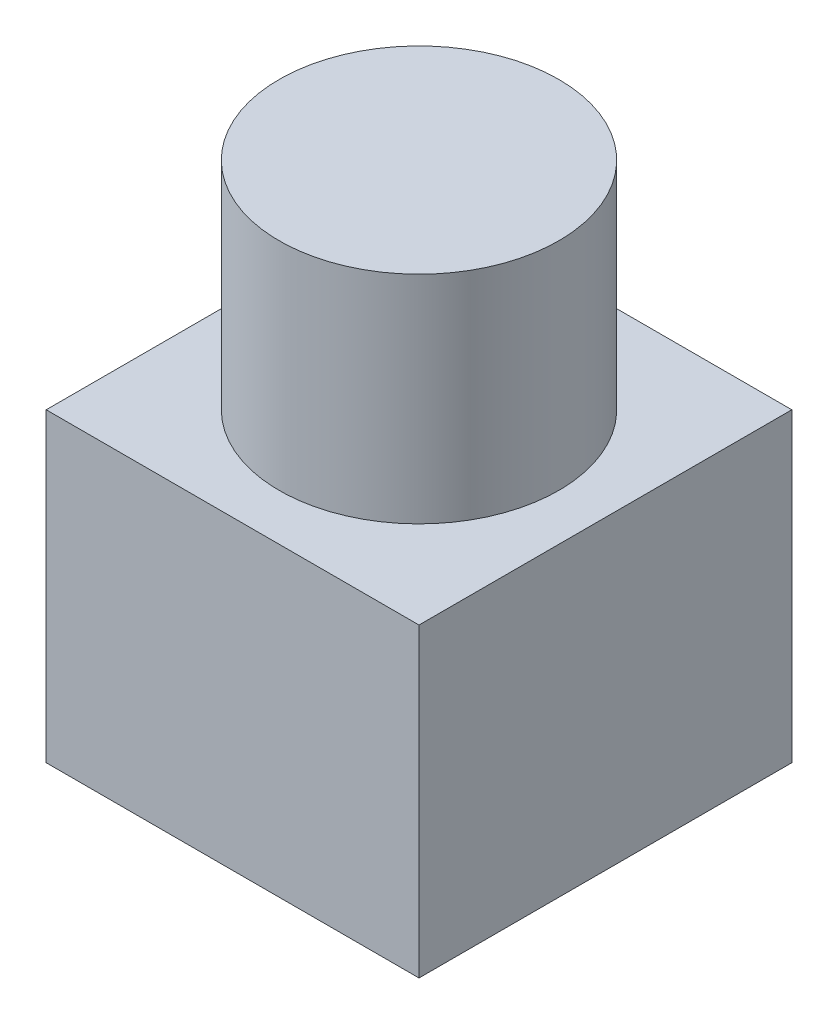
ISO-10303-21;
HEADER;
FILE_DESCRIPTION(('STEP AP214'),'2;1');
FILE_NAME('part.step','',(''),(''),'','','');
FILE_SCHEMA(('AUTOMOTIVE_DESIGN { 1 0 10303 214 1 1 1 1 }'));
ENDSEC;
DATA;
#1=APPLICATION_CONTEXT('core data for automotive mechanical design processes');
#2=APPLICATION_PROTOCOL_DEFINITION('international standard','automotive_design',2000,#1);
#3=PRODUCT_CONTEXT('',#1,'mechanical');
#4=PRODUCT('Part','Part','',(#3));
#5=PRODUCT_RELATED_PRODUCT_CATEGORY('part','',(#4));
#6=PRODUCT_DEFINITION_FORMATION('','',#4);
#7=PRODUCT_DEFINITION_CONTEXT('part definition',#1,'design');
#8=PRODUCT_DEFINITION('design','',#6,#7);
#9=PRODUCT_DEFINITION_SHAPE('','',#8);
#10=(LENGTH_UNIT() NAMED_UNIT(*) SI_UNIT(.MILLI.,.METRE.));
#11=(NAMED_UNIT(*) PLANE_ANGLE_UNIT() SI_UNIT($,.RADIAN.));
#12=(NAMED_UNIT(*) SI_UNIT($,.STERADIAN.) SOLID_ANGLE_UNIT());
#13=UNCERTAINTY_MEASURE_WITH_UNIT(LENGTH_MEASURE(1.E-05),#10,'distance_accuracy_value','');
#14=(GEOMETRIC_REPRESENTATION_CONTEXT(3) GLOBAL_UNCERTAINTY_ASSIGNED_CONTEXT((#13)) GLOBAL_UNIT_ASSIGNED_CONTEXT((#10,
#11,#12)) REPRESENTATION_CONTEXT('',''));
#15=CARTESIAN_POINT('',(0.,0.,0.));
#16=DIRECTION('',(0.,0.,1.));
#17=DIRECTION('',(1.,0.,0.));
#18=AXIS2_PLACEMENT_3D('',#15,#16,#17);
#19=CARTESIAN_POINT('',(25.,41.,25.));
#20=DIRECTION('',(-1.,0.,0.));
#21=DIRECTION('',(0.,0.,1.));
#22=AXIS2_PLACEMENT_3D('',#19,#20,#21);
#23=PLANE('',#22);
#24=DIRECTION('',(0.,0.,-1.));
#25=VECTOR('',#24,1.);
#26=CARTESIAN_POINT('',(25.,0.,25.));
#27=LINE('',#26,#25);
#28=CARTESIAN_POINT('',(25.,0.,25.));
#29=VERTEX_POINT('',#28);
#30=CARTESIAN_POINT('',(25.,0.,-25.));
#31=VERTEX_POINT('',#30);
#32=EDGE_CURVE('E98',#29,#31,#27,.T.);
#33=ORIENTED_EDGE('',*,*,#32,.T.);
#34=DIRECTION('',(0.,-1.,0.));
#35=VECTOR('',#34,1.);
#36=CARTESIAN_POINT('',(25.,41.,-25.));
#37=LINE('',#36,#35);
#38=CARTESIAN_POINT('',(25.,41.,-25.));
#39=VERTEX_POINT('',#38);
#40=EDGE_CURVE('E40',#39,#31,#37,.T.);
#41=ORIENTED_EDGE('',*,*,#40,.F.);
#42=DIRECTION('',(0.,0.,-1.));
#43=VECTOR('',#42,1.);
#44=CARTESIAN_POINT('',(25.,41.,25.));
#45=LINE('',#44,#43);
#46=CARTESIAN_POINT('',(25.,41.,25.));
#47=VERTEX_POINT('',#46);
#48=EDGE_CURVE('E84',#47,#39,#45,.T.);
#49=ORIENTED_EDGE('',*,*,#48,.F.);
#50=DIRECTION('',(0.,-1.,0.));
#51=VECTOR('',#50,1.);
#52=CARTESIAN_POINT('',(25.,41.,25.));
#53=LINE('',#52,#51);
#54=EDGE_CURVE('E94',#47,#29,#53,.T.);
#55=ORIENTED_EDGE('',*,*,#54,.T.);
#56=EDGE_LOOP('',(#33,#41,#49,#55));
#57=FACE_BOUND('',#56,.T.);
#58=ADVANCED_FACE('F32',(#57),#23,.F.);
#59=CARTESIAN_POINT('',(-25.,41.,-25.));
#60=DIRECTION('',(0.,0.,1.));
#61=DIRECTION('',(1.,0.,0.));
#62=AXIS2_PLACEMENT_3D('',#59,#60,#61);
#63=PLANE('',#62);
#64=DIRECTION('',(-1.,0.,0.));
#65=VECTOR('',#64,1.);
#66=CARTESIAN_POINT('',(-25.,0.,-25.));
#67=LINE('',#66,#65);
#68=CARTESIAN_POINT('',(-25.,0.,-25.));
#69=VERTEX_POINT('',#68);
#70=EDGE_CURVE('E89',#31,#69,#67,.T.);
#71=ORIENTED_EDGE('',*,*,#70,.T.);
#72=DIRECTION('',(0.,-1.,0.));
#73=VECTOR('',#72,1.);
#74=CARTESIAN_POINT('',(-25.,41.,-25.));
#75=LINE('',#74,#73);
#76=CARTESIAN_POINT('',(-25.,41.,-25.));
#77=VERTEX_POINT('',#76);
#78=EDGE_CURVE('E87',#77,#69,#75,.T.);
#79=ORIENTED_EDGE('',*,*,#78,.F.);
#80=DIRECTION('',(-1.,0.,0.));
#81=VECTOR('',#80,1.);
#82=CARTESIAN_POINT('',(-25.,41.,-25.));
#83=LINE('',#82,#81);
#84=EDGE_CURVE('E79',#39,#77,#83,.T.);
#85=ORIENTED_EDGE('',*,*,#84,.F.);
#86=ORIENTED_EDGE('',*,*,#40,.T.);
#87=EDGE_LOOP('',(#71,#79,#85,#86));
#88=FACE_BOUND('',#87,.T.);
#89=ADVANCED_FACE('F88',(#88),#63,.F.);
#90=CARTESIAN_POINT('',(-25.,41.,25.));
#91=DIRECTION('',(1.,0.,0.));
#92=DIRECTION('',(0.,0.,-1.));
#93=AXIS2_PLACEMENT_3D('',#90,#91,#92);
#94=PLANE('',#93);
#95=DIRECTION('',(0.,0.,1.));
#96=VECTOR('',#95,1.);
#97=CARTESIAN_POINT('',(-25.,0.,25.));
#98=LINE('',#97,#96);
#99=CARTESIAN_POINT('',(-25.,0.,25.));
#100=VERTEX_POINT('',#99);
#101=EDGE_CURVE('E65',#69,#100,#98,.T.);
#102=ORIENTED_EDGE('',*,*,#101,.T.);
#103=DIRECTION('',(0.,-1.,0.));
#104=VECTOR('',#103,1.);
#105=CARTESIAN_POINT('',(-25.,41.,25.));
#106=LINE('',#105,#104);
#107=CARTESIAN_POINT('',(-25.,41.,25.));
#108=VERTEX_POINT('',#107);
#109=EDGE_CURVE('E90',#108,#100,#106,.T.);
#110=ORIENTED_EDGE('',*,*,#109,.F.);
#111=DIRECTION('',(0.,0.,1.));
#112=VECTOR('',#111,1.);
#113=CARTESIAN_POINT('',(-25.,41.,25.));
#114=LINE('',#113,#112);
#115=EDGE_CURVE('E82',#77,#108,#114,.T.);
#116=ORIENTED_EDGE('',*,*,#115,.F.);
#117=ORIENTED_EDGE('',*,*,#78,.T.);
#118=EDGE_LOOP('',(#102,#110,#116,#117));
#119=FACE_BOUND('',#118,.T.);
#120=ADVANCED_FACE('F92',(#119),#94,.F.);
#121=CARTESIAN_POINT('',(-25.,41.,25.));
#122=DIRECTION('',(0.,0.,-1.));
#123=DIRECTION('',(-1.,0.,0.));
#124=AXIS2_PLACEMENT_3D('',#121,#122,#123);
#125=PLANE('',#124);
#126=DIRECTION('',(1.,0.,0.));
#127=VECTOR('',#126,1.);
#128=CARTESIAN_POINT('',(-25.,0.,25.));
#129=LINE('',#128,#127);
#130=EDGE_CURVE('E71',#100,#29,#129,.T.);
#131=ORIENTED_EDGE('',*,*,#130,.T.);
#132=ORIENTED_EDGE('',*,*,#54,.F.);
#133=DIRECTION('',(1.,0.,0.));
#134=VECTOR('',#133,1.);
#135=CARTESIAN_POINT('',(-25.,41.,25.));
#136=LINE('',#135,#134);
#137=EDGE_CURVE('E48',#108,#47,#136,.T.);
#138=ORIENTED_EDGE('',*,*,#137,.F.);
#139=ORIENTED_EDGE('',*,*,#109,.T.);
#140=EDGE_LOOP('',(#131,#132,#138,#139));
#141=FACE_BOUND('',#140,.T.);
#142=ADVANCED_FACE('F120',(#141),#125,.F.);
#143=CARTESIAN_POINT('',(0.,41.,0.));
#144=DIRECTION('',(0.,-1.,0.));
#145=DIRECTION('',(0.,0.,-1.));
#146=AXIS2_PLACEMENT_3D('',#143,#144,#145);
#147=PLANE('',#146);
#148=CARTESIAN_POINT('',(0.,41.,0.));
#149=DIRECTION('',(0.,-1.,0.));
#150=DIRECTION('',(0.,0.,-1.));
#151=AXIS2_PLACEMENT_3D('',#148,#149,#150);
#152=CIRCLE('',#151,18.75);
#153=CARTESIAN_POINT('',(0.,41.,-18.75));
#154=VERTEX_POINT('',#153);
#155=EDGE_CURVE('E11',#154,#154,#152,.F.);
#156=ORIENTED_EDGE('',*,*,#155,.F.);
#157=EDGE_LOOP('',(#156));
#158=FACE_BOUND('',#157,.T.);
#159=ORIENTED_EDGE('',*,*,#48,.T.);
#160=ORIENTED_EDGE('',*,*,#84,.T.);
#161=ORIENTED_EDGE('',*,*,#115,.T.);
#162=ORIENTED_EDGE('',*,*,#137,.T.);
#163=EDGE_LOOP('',(#159,#160,#161,#162));
#164=FACE_BOUND('',#163,.T.);
#165=ADVANCED_FACE('F80',(#158,#164),#147,.F.);
#166=CARTESIAN_POINT('',(0.,0.,0.));
#167=DIRECTION('',(0.,-1.,0.));
#168=DIRECTION('',(0.,0.,-1.));
#169=AXIS2_PLACEMENT_3D('',#166,#167,#168);
#170=PLANE('',#169);
#171=ORIENTED_EDGE('',*,*,#32,.F.);
#172=ORIENTED_EDGE('',*,*,#130,.F.);
#173=ORIENTED_EDGE('',*,*,#101,.F.);
#174=ORIENTED_EDGE('',*,*,#70,.F.);
#175=EDGE_LOOP('',(#171,#172,#173,#174));
#176=FACE_BOUND('',#175,.T.);
#177=ADVANCED_FACE('F109',(#176),#170,.T.);
#178=CARTESIAN_POINT('',(0.,70.,0.));
#179=DIRECTION('',(0.,-1.,0.));
#180=DIRECTION('',(0.,0.,-1.));
#181=AXIS2_PLACEMENT_3D('',#178,#179,#180);
#182=CYLINDRICAL_SURFACE('',#181,18.75);
#183=CARTESIAN_POINT('',(0.,70.,0.));
#184=DIRECTION('',(0.,1.,0.));
#185=DIRECTION('',(0.,0.,1.));
#186=AXIS2_PLACEMENT_3D('',#183,#184,#185);
#187=CIRCLE('',#186,18.75);
#188=CARTESIAN_POINT('',(0.,70.,-18.75));
#189=VERTEX_POINT('',#188);
#190=EDGE_CURVE('E101',#189,#189,#187,.T.);
#191=CARTESIAN_POINT('',(0.,70.,-18.75));
#192=CARTESIAN_POINT('',(0.,69.6979166666667,-18.75));
#193=CARTESIAN_POINT('',(0.,69.3958333333333,-18.75));
#194=CARTESIAN_POINT('',(0.,68.7916666666667,-18.75));
#195=CARTESIAN_POINT('',(0.,68.4895833333333,-18.75));
#196=CARTESIAN_POINT('',(0.,67.8854166666667,-18.75));
#197=CARTESIAN_POINT('',(0.,67.5833333333333,-18.75));
#198=CARTESIAN_POINT('',(0.,66.9791666666667,-18.75));
#199=CARTESIAN_POINT('',(0.,66.6770833333333,-18.75));
#200=CARTESIAN_POINT('',(0.,66.0729166666667,-18.75));
#201=CARTESIAN_POINT('',(0.,65.7708333333333,-18.75));
#202=CARTESIAN_POINT('',(0.,65.1666666666667,-18.75));
#203=CARTESIAN_POINT('',(0.,64.8645833333333,-18.75));
#204=CARTESIAN_POINT('',(0.,64.2604166666667,-18.75));
#205=CARTESIAN_POINT('',(0.,63.9583333333333,-18.75));
#206=CARTESIAN_POINT('',(0.,63.3541666666667,-18.75));
#207=CARTESIAN_POINT('',(0.,63.0520833333333,-18.75));
#208=CARTESIAN_POINT('',(0.,62.4479166666667,-18.75));
#209=CARTESIAN_POINT('',(0.,62.1458333333333,-18.75));
#210=CARTESIAN_POINT('',(0.,61.5416666666667,-18.75));
#211=CARTESIAN_POINT('',(0.,61.2395833333333,-18.75));
#212=CARTESIAN_POINT('',(0.,60.6354166666667,-18.75));
#213=CARTESIAN_POINT('',(0.,60.3333333333333,-18.75));
#214=CARTESIAN_POINT('',(0.,59.7291666666667,-18.75));
#215=CARTESIAN_POINT('',(0.,59.4270833333333,-18.75));
#216=CARTESIAN_POINT('',(0.,58.8229166666667,-18.75));
#217=CARTESIAN_POINT('',(0.,58.5208333333333,-18.75));
#218=CARTESIAN_POINT('',(0.,57.9166666666667,-18.75));
#219=CARTESIAN_POINT('',(0.,57.6145833333333,-18.75));
#220=CARTESIAN_POINT('',(0.,57.0104166666667,-18.75));
#221=CARTESIAN_POINT('',(0.,56.7083333333333,-18.75));
#222=CARTESIAN_POINT('',(0.,56.1041666666667,-18.75));
#223=CARTESIAN_POINT('',(0.,55.8020833333333,-18.75));
#224=CARTESIAN_POINT('',(0.,55.1979166666667,-18.75));
#225=CARTESIAN_POINT('',(0.,54.8958333333333,-18.75));
#226=CARTESIAN_POINT('',(0.,54.2916666666667,-18.75));
#227=CARTESIAN_POINT('',(0.,53.9895833333333,-18.75));
#228=CARTESIAN_POINT('',(0.,53.3854166666667,-18.75));
#229=CARTESIAN_POINT('',(0.,53.0833333333333,-18.75));
#230=CARTESIAN_POINT('',(0.,52.4791666666667,-18.75));
#231=CARTESIAN_POINT('',(0.,52.1770833333333,-18.75));
#232=CARTESIAN_POINT('',(0.,51.5729166666667,-18.75));
#233=CARTESIAN_POINT('',(0.,51.2708333333333,-18.75));
#234=CARTESIAN_POINT('',(0.,50.6666666666667,-18.75));
#235=CARTESIAN_POINT('',(0.,50.3645833333333,-18.75));
#236=CARTESIAN_POINT('',(0.,49.7604166666667,-18.75));
#237=CARTESIAN_POINT('',(0.,49.4583333333333,-18.75));
#238=CARTESIAN_POINT('',(0.,48.8541666666667,-18.75));
#239=CARTESIAN_POINT('',(0.,48.5520833333333,-18.75));
#240=CARTESIAN_POINT('',(0.,47.9479166666667,-18.75));
#241=CARTESIAN_POINT('',(0.,47.6458333333333,-18.75));
#242=CARTESIAN_POINT('',(0.,47.0416666666667,-18.75));
#243=CARTESIAN_POINT('',(0.,46.7395833333333,-18.75));
#244=CARTESIAN_POINT('',(0.,46.1354166666667,-18.75));
#245=CARTESIAN_POINT('',(0.,45.8333333333333,-18.75));
#246=CARTESIAN_POINT('',(0.,45.2291666666667,-18.75));
#247=CARTESIAN_POINT('',(0.,44.9270833333333,-18.75));
#248=CARTESIAN_POINT('',(0.,44.3229166666667,-18.75));
#249=CARTESIAN_POINT('',(0.,44.0208333333333,-18.75));
#250=CARTESIAN_POINT('',(0.,43.4166666666667,-18.75));
#251=CARTESIAN_POINT('',(0.,43.1145833333333,-18.75));
#252=CARTESIAN_POINT('',(0.,42.5104166666667,-18.75));
#253=CARTESIAN_POINT('',(0.,42.2083333333333,-18.75));
#254=CARTESIAN_POINT('',(0.,41.6041666666667,-18.75));
#255=CARTESIAN_POINT('',(0.,41.3020833333333,-18.75));
#256=CARTESIAN_POINT('',(0.,41.,-18.75));
#257=B_SPLINE_CURVE_WITH_KNOTS('',3,(#191,#192,#193,#194,#195,#196,#197,#198,#199,#200,#201,
#202,#203,#204,#205,#206,#207,#208,#209,#210,#211,#212,#213,#214,#215,#216,#217,#218,#219,#220,
#221,#222,#223,#224,#225,#226,#227,#228,#229,#230,#231,#232,#233,#234,#235,#236,#237,#238,#239,
#240,#241,#242,#243,#244,#245,#246,#247,#248,#249,#250,#251,#252,#253,#254,#255,#256),
.UNSPECIFIED.,.F.,.F.,(4,2,2,2,2,2,2,2,2,2,2,2,2,2,2,2,2,2,2,2,2,2,2,2,2,2,2,2,2,2,2,2,4),(0.,
0.906250000000011,1.81250000000001,2.71875000000001,3.625,4.53125,5.43750000000001,
6.34375000000001,7.25000000000001,8.15625,9.0625,9.96875000000001,10.875,11.78125,12.6875,
13.59375,14.5,15.40625,16.3125,17.21875,18.125,19.03125,19.9375,20.84375,21.75,22.65625,23.5625,
24.46875,25.375,26.28125,27.1875,28.09375,29.),.UNSPECIFIED.);
#258=EDGE_CURVE('BSEAM111',#189,#154,#257,.T.);
#259=ORIENTED_EDGE('',*,*,#190,.F.);
#260=ORIENTED_EDGE('',*,*,#155,.T.);
#261=ORIENTED_EDGE('',*,*,#258,.T.);
#262=ORIENTED_EDGE('',*,*,#258,.F.);
#263=EDGE_LOOP('',(#259,#261,#260,#262));
#264=FACE_BOUND('',#263,.T.);
#265=ADVANCED_FACE('F111',(#264),#182,.T.);
#266=CARTESIAN_POINT('',(0.,70.,0.));
#267=DIRECTION('',(0.,1.,0.));
#268=DIRECTION('',(0.,0.,1.));
#269=AXIS2_PLACEMENT_3D('',#266,#267,#268);
#270=PLANE('',#269);
#271=ORIENTED_EDGE('',*,*,#190,.T.);
#272=EDGE_LOOP('',(#271));
#273=FACE_BOUND('',#272,.T.);
#274=ADVANCED_FACE('F117',(#273),#270,.T.);
#275=CLOSED_SHELL('',(#58,#89,#120,#142,#165,#177,#265,#274));
#276=MANIFOLD_SOLID_BREP('B2',#275);
#277=ADVANCED_BREP_SHAPE_REPRESENTATION('',(#18,#276),#14);
#278=SHAPE_DEFINITION_REPRESENTATION(#9,#277);
ENDSEC;
END-ISO-10303-21;
